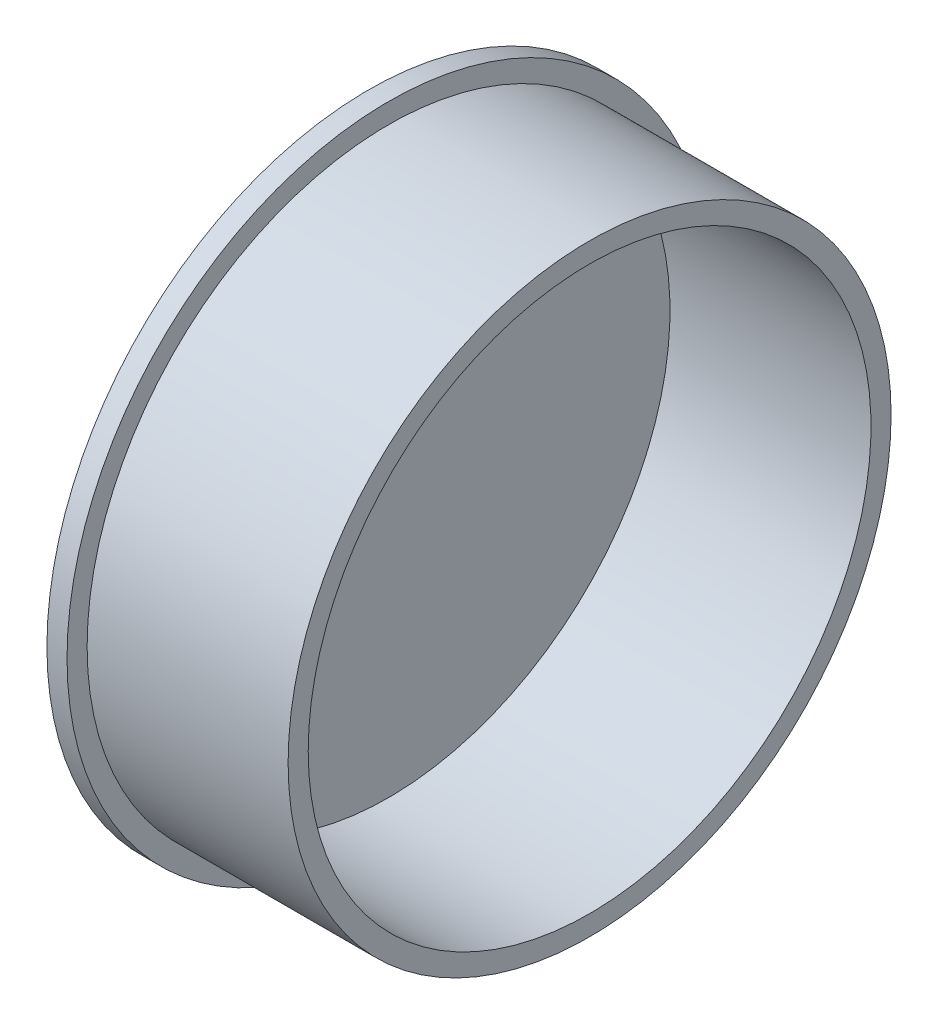
ISO-10303-21;
HEADER;
FILE_DESCRIPTION(('STEP AP214'),'2;1');
FILE_NAME('part.step','',(''),(''),'','','');
FILE_SCHEMA(('AUTOMOTIVE_DESIGN { 1 0 10303 214 1 1 1 1 }'));
ENDSEC;
DATA;
#1=APPLICATION_CONTEXT('core data for automotive mechanical design processes');
#2=APPLICATION_PROTOCOL_DEFINITION('international standard','automotive_design',2000,#1);
#3=PRODUCT_CONTEXT('',#1,'mechanical');
#4=PRODUCT('Part','Part','',(#3));
#5=PRODUCT_RELATED_PRODUCT_CATEGORY('part','',(#4));
#6=PRODUCT_DEFINITION_FORMATION('','',#4);
#7=PRODUCT_DEFINITION_CONTEXT('part definition',#1,'design');
#8=PRODUCT_DEFINITION('design','',#6,#7);
#9=PRODUCT_DEFINITION_SHAPE('','',#8);
#10=(LENGTH_UNIT() NAMED_UNIT(*) SI_UNIT(.MILLI.,.METRE.));
#11=(NAMED_UNIT(*) PLANE_ANGLE_UNIT() SI_UNIT($,.RADIAN.));
#12=(NAMED_UNIT(*) SI_UNIT($,.STERADIAN.) SOLID_ANGLE_UNIT());
#13=UNCERTAINTY_MEASURE_WITH_UNIT(LENGTH_MEASURE(1.E-05),#10,'distance_accuracy_value','');
#14=(GEOMETRIC_REPRESENTATION_CONTEXT(3) GLOBAL_UNCERTAINTY_ASSIGNED_CONTEXT((#13)) GLOBAL_UNIT_ASSIGNED_CONTEXT((#10,
#11,#12)) REPRESENTATION_CONTEXT('',''));
#15=CARTESIAN_POINT('',(0.,0.,0.));
#16=DIRECTION('',(0.,0.,1.));
#17=DIRECTION('',(1.,0.,0.));
#18=AXIS2_PLACEMENT_3D('',#15,#16,#17);
#19=CARTESIAN_POINT('',(50.,0.,0.));
#20=DIRECTION('',(1.,0.,0.));
#21=DIRECTION('',(0.,0.,-1.));
#22=AXIS2_PLACEMENT_3D('',#19,#20,#21);
#23=PLANE('',#22);
#24=CARTESIAN_POINT('',(50.,0.,0.));
#25=DIRECTION('',(-1.,0.,0.));
#26=DIRECTION('',(0.,0.,1.));
#27=AXIS2_PLACEMENT_3D('',#24,#25,#26);
#28=CIRCLE('',#27,70.);
#29=CARTESIAN_POINT('',(50.,0.,70.));
#30=VERTEX_POINT('',#29);
#31=EDGE_CURVE('E54',#30,#30,#28,.T.);
#32=ORIENTED_EDGE('',*,*,#31,.T.);
#33=EDGE_LOOP('',(#32));
#34=FACE_BOUND('',#33,.T.);
#35=CARTESIAN_POINT('',(50.,0.,0.));
#36=DIRECTION('',(-1.,0.,0.));
#37=DIRECTION('',(0.,0.,1.));
#38=AXIS2_PLACEMENT_3D('',#35,#36,#37);
#39=CIRCLE('',#38,75.);
#40=CARTESIAN_POINT('',(50.,0.,75.));
#41=VERTEX_POINT('',#40);
#42=EDGE_CURVE('E10',#41,#41,#39,.T.);
#43=ORIENTED_EDGE('',*,*,#42,.F.);
#44=EDGE_LOOP('',(#43));
#45=FACE_BOUND('',#44,.T.);
#46=ADVANCED_FACE('F33',(#34,#45),#23,.T.);
#47=CARTESIAN_POINT('',(0.,0.,0.));
#48=DIRECTION('',(-1.,0.,0.));
#49=DIRECTION('',(0.,0.,1.));
#50=AXIS2_PLACEMENT_3D('',#47,#48,#49);
#51=CYLINDRICAL_SURFACE('',#50,70.);
#52=ORIENTED_EDGE('',*,*,#31,.F.);
#53=EDGE_LOOP('',(#52));
#54=FACE_BOUND('',#53,.T.);
#55=CARTESIAN_POINT('',(0.,0.,0.));
#56=DIRECTION('',(-1.,0.,0.));
#57=DIRECTION('',(0.,0.,1.));
#58=AXIS2_PLACEMENT_3D('',#55,#56,#57);
#59=CIRCLE('',#58,70.);
#60=CARTESIAN_POINT('',(0.,0.,70.));
#61=VERTEX_POINT('',#60);
#62=EDGE_CURVE('E46',#61,#61,#59,.T.);
#63=ORIENTED_EDGE('',*,*,#62,.T.);
#64=EDGE_LOOP('',(#63));
#65=FACE_BOUND('',#64,.T.);
#66=ADVANCED_FACE('F64',(#54,#65),#51,.F.);
#67=CARTESIAN_POINT('',(0.,0.,0.));
#68=DIRECTION('',(-1.,0.,0.));
#69=DIRECTION('',(0.,0.,1.));
#70=AXIS2_PLACEMENT_3D('',#67,#68,#69);
#71=CYLINDRICAL_SURFACE('',#70,75.);
#72=ORIENTED_EDGE('',*,*,#42,.T.);
#73=EDGE_LOOP('',(#72));
#74=FACE_BOUND('',#73,.T.);
#75=CARTESIAN_POINT('',(0.,0.,0.));
#76=DIRECTION('',(-1.,0.,0.));
#77=DIRECTION('',(0.,0.,1.));
#78=AXIS2_PLACEMENT_3D('',#75,#76,#77);
#79=CIRCLE('',#78,75.);
#80=CARTESIAN_POINT('',(0.,0.,75.));
#81=VERTEX_POINT('',#80);
#82=EDGE_CURVE('E41',#81,#81,#79,.T.);
#83=ORIENTED_EDGE('',*,*,#82,.F.);
#84=EDGE_LOOP('',(#83));
#85=FACE_BOUND('',#84,.T.);
#86=ADVANCED_FACE('F68',(#74,#85),#71,.T.);
#87=CARTESIAN_POINT('',(0.,0.,0.));
#88=DIRECTION('',(-1.,0.,0.));
#89=DIRECTION('',(0.,0.,1.));
#90=AXIS2_PLACEMENT_3D('',#87,#88,#89);
#91=PLANE('',#90);
#92=ORIENTED_EDGE('',*,*,#62,.F.);
#93=EDGE_LOOP('',(#92));
#94=FACE_BOUND('',#93,.T.);
#95=ADVANCED_FACE('F66',(#94),#91,.F.);
#96=CARTESIAN_POINT('',(-5.,0.,0.));
#97=DIRECTION('',(-1.,0.,0.));
#98=DIRECTION('',(0.,0.,1.));
#99=AXIS2_PLACEMENT_3D('',#96,#97,#98);
#100=PLANE('',#99);
#101=CARTESIAN_POINT('',(-5.,0.,0.));
#102=DIRECTION('',(-1.,0.,0.));
#103=DIRECTION('',(0.,0.,1.));
#104=AXIS2_PLACEMENT_3D('',#101,#102,#103);
#105=CIRCLE('',#104,80.);
#106=CARTESIAN_POINT('',(-5.,0.,80.));
#107=VERTEX_POINT('',#106);
#108=EDGE_CURVE('E37',#107,#107,#105,.T.);
#109=ORIENTED_EDGE('',*,*,#108,.T.);
#110=EDGE_LOOP('',(#109));
#111=FACE_BOUND('',#110,.T.);
#112=ADVANCED_FACE('F35',(#111),#100,.T.);
#113=CARTESIAN_POINT('',(0.,0.,0.));
#114=DIRECTION('',(-1.,0.,0.));
#115=DIRECTION('',(0.,0.,1.));
#116=AXIS2_PLACEMENT_3D('',#113,#114,#115);
#117=CYLINDRICAL_SURFACE('',#116,80.);
#118=ORIENTED_EDGE('',*,*,#108,.F.);
#119=EDGE_LOOP('',(#118));
#120=FACE_BOUND('',#119,.T.);
#121=CARTESIAN_POINT('',(0.,0.,0.));
#122=DIRECTION('',(-1.,0.,0.));
#123=DIRECTION('',(0.,0.,1.));
#124=AXIS2_PLACEMENT_3D('',#121,#122,#123);
#125=CIRCLE('',#124,80.);
#126=CARTESIAN_POINT('',(0.,0.,80.));
#127=VERTEX_POINT('',#126);
#128=EDGE_CURVE('E49',#127,#127,#125,.T.);
#129=ORIENTED_EDGE('',*,*,#128,.T.);
#130=EDGE_LOOP('',(#129));
#131=FACE_BOUND('',#130,.T.);
#132=ADVANCED_FACE('F75',(#120,#131),#117,.T.);
#133=ORIENTED_EDGE('',*,*,#82,.T.);
#134=EDGE_LOOP('',(#133));
#135=FACE_BOUND('',#134,.T.);
#136=ORIENTED_EDGE('',*,*,#128,.F.);
#137=EDGE_LOOP('',(#136));
#138=FACE_BOUND('',#137,.T.);
#139=ADVANCED_FACE('F70',(#135,#138),#91,.F.);
#140=CLOSED_SHELL('',(#46,#66,#86,#95,#112,#132,#139));
#141=MANIFOLD_SOLID_BREP('B2',#140);
#142=ADVANCED_BREP_SHAPE_REPRESENTATION('',(#18,#141),#14);
#143=SHAPE_DEFINITION_REPRESENTATION(#9,#142);
ENDSEC;
END-ISO-10303-21;
